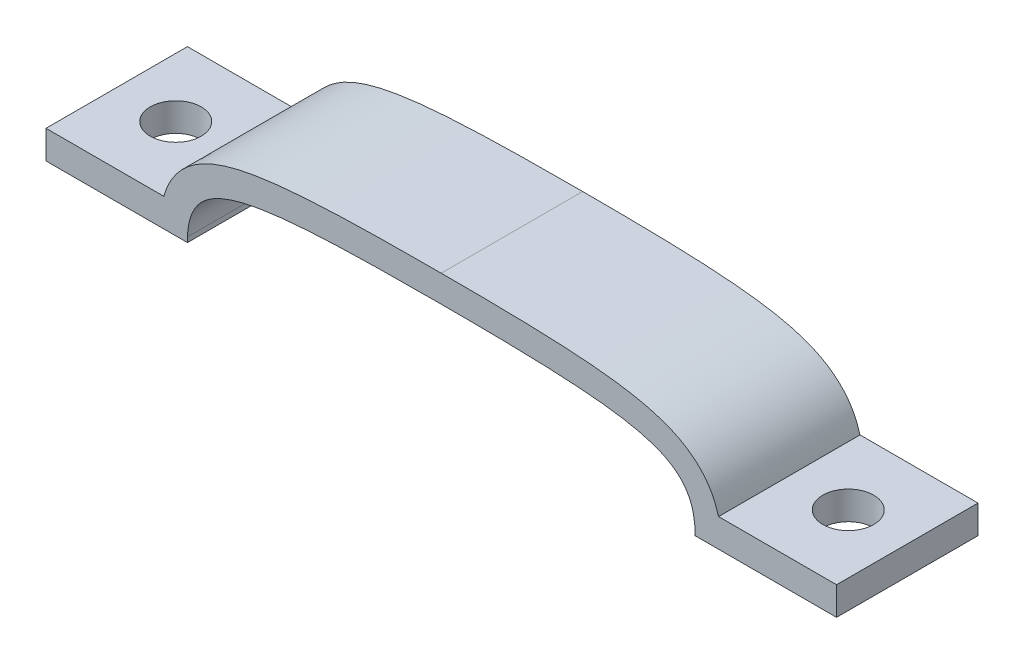
ISO-10303-21;
HEADER;
FILE_DESCRIPTION(('STEP AP214'),'2;1');
FILE_NAME('part.step','',(''),(''),'','','');
FILE_SCHEMA(('AUTOMOTIVE_DESIGN { 1 0 10303 214 1 1 1 1 }'));
ENDSEC;
DATA;
#1=APPLICATION_CONTEXT('core data for automotive mechanical design processes');
#2=APPLICATION_PROTOCOL_DEFINITION('international standard','automotive_design',2000,#1);
#3=PRODUCT_CONTEXT('',#1,'mechanical');
#4=PRODUCT('Part','Part','',(#3));
#5=PRODUCT_RELATED_PRODUCT_CATEGORY('part','',(#4));
#6=PRODUCT_DEFINITION_FORMATION('','',#4);
#7=PRODUCT_DEFINITION_CONTEXT('part definition',#1,'design');
#8=PRODUCT_DEFINITION('design','',#6,#7);
#9=PRODUCT_DEFINITION_SHAPE('','',#8);
#10=(LENGTH_UNIT() NAMED_UNIT(*) SI_UNIT(.MILLI.,.METRE.));
#11=(NAMED_UNIT(*) PLANE_ANGLE_UNIT() SI_UNIT($,.RADIAN.));
#12=(NAMED_UNIT(*) SI_UNIT($,.STERADIAN.) SOLID_ANGLE_UNIT());
#13=UNCERTAINTY_MEASURE_WITH_UNIT(LENGTH_MEASURE(1.E-05),#10,'distance_accuracy_value','');
#14=(GEOMETRIC_REPRESENTATION_CONTEXT(3) GLOBAL_UNCERTAINTY_ASSIGNED_CONTEXT((#13)) GLOBAL_UNIT_ASSIGNED_CONTEXT((#10,
#11,#12)) REPRESENTATION_CONTEXT('',''));
#15=CARTESIAN_POINT('',(0.,0.,0.));
#16=DIRECTION('',(0.,0.,1.));
#17=DIRECTION('',(1.,0.,0.));
#18=AXIS2_PLACEMENT_3D('',#15,#16,#17);
#19=CARTESIAN_POINT('',(-22.279226419423,158.086868585833,10.));
#20=CARTESIAN_POINT('',(-22.2792264195466,158.360588105045,10.));
#21=CARTESIAN_POINT('',(-22.2961874695407,158.836368300295,10.));
#22=CARTESIAN_POINT('',(-22.3755631938051,159.447800617401,10.));
#23=CARTESIAN_POINT('',(-22.4760885577974,159.928281388601,10.));
#24=CARTESIAN_POINT('',(-22.5787710775966,160.307063701637,10.));
#25=CARTESIAN_POINT('',(-22.8045355407532,160.930325250864,10.));
#26=CARTESIAN_POINT('',(-23.2235802799901,161.72514302767,10.));
#27=CARTESIAN_POINT('',(-23.9479829881295,162.553558881146,10.));
#28=CARTESIAN_POINT('',(-25.0052592771367,163.370103577405,10.));
#29=CARTESIAN_POINT('',(-26.3471290029243,163.971682922018,10.));
#30=CARTESIAN_POINT('',(-27.8024570779386,164.375196309339,10.));
#31=CARTESIAN_POINT('',(-29.2062184045047,164.632537515614,10.));
#32=CARTESIAN_POINT('',(-30.5609400295417,164.805515449446,10.));
#33=CARTESIAN_POINT('',(-32.3384486561694,164.966218973878,10.));
#34=CARTESIAN_POINT('',(-34.5145025536922,165.081677344798,10.));
#35=CARTESIAN_POINT('',(-37.085705754605,165.151738274241,10.));
#36=CARTESIAN_POINT('',(-39.6278532585629,165.182162428215,10.));
#37=CARTESIAN_POINT('',(-41.2929588781587,165.186859645389,10.));
#38=CARTESIAN_POINT('',(-42.1292264699186,165.186859626176,10.));
#39=B_SPLINE_CURVE_WITH_KNOTS('',3,(#19,#20,#21,#22,#23,#24,#25,#26,#27,#28,#29,#30,#31,#32,#33,
#34,#35,#36,#37,#38),.UNSPECIFIED.,.F.,.F.,(4,1,1,1,1,1,1,1,1,1,1,1,1,1,1,1,1,4),
(0.755163082288405,0.762814235966892,0.768955564618549,0.77086835303817,0.774693929877414,
0.778116543323867,0.785767697002354,0.793418850680842,0.801070004359329,0.816372311716304,
0.831674619073278,0.846976926430253,0.862279233787228,0.877581541144203,0.908186155858152,
0.938790770572101,0.969395385286051,1.),.UNSPECIFIED.);
#40=DIRECTION('',(0.,0.,-1.));
#41=VECTOR('',#40,1.);
#42=SURFACE_OF_LINEAR_EXTRUSION('',#39,#41);
#43=CARTESIAN_POINT('',(-22.279226419423,158.086868585833,0.));
#44=CARTESIAN_POINT('',(-22.2792264195466,158.360588105045,0.));
#45=CARTESIAN_POINT('',(-22.2961874695407,158.836368300295,0.));
#46=CARTESIAN_POINT('',(-22.3755631938051,159.447800617401,0.));
#47=CARTESIAN_POINT('',(-22.4760885577974,159.928281388601,0.));
#48=CARTESIAN_POINT('',(-22.5787710775966,160.307063701637,0.));
#49=CARTESIAN_POINT('',(-22.8045355407532,160.930325250864,0.));
#50=CARTESIAN_POINT('',(-23.2235802799901,161.72514302767,0.));
#51=CARTESIAN_POINT('',(-23.9479829881295,162.553558881146,0.));
#52=CARTESIAN_POINT('',(-25.0052592771367,163.370103577405,0.));
#53=CARTESIAN_POINT('',(-26.3471290029243,163.971682922018,0.));
#54=CARTESIAN_POINT('',(-27.8024570779386,164.375196309339,0.));
#55=CARTESIAN_POINT('',(-29.2062184045047,164.632537515614,0.));
#56=CARTESIAN_POINT('',(-30.5609400295417,164.805515449446,0.));
#57=CARTESIAN_POINT('',(-32.3384486561694,164.966218973878,0.));
#58=CARTESIAN_POINT('',(-34.5145025536922,165.081677344798,0.));
#59=CARTESIAN_POINT('',(-37.085705754605,165.151738274241,0.));
#60=CARTESIAN_POINT('',(-39.6278532585629,165.182162428215,0.));
#61=CARTESIAN_POINT('',(-41.2929588781587,165.186859645389,0.));
#62=CARTESIAN_POINT('',(-42.1292264699186,165.186859626176,0.));
#63=B_SPLINE_CURVE_WITH_KNOTS('',3,(#43,#44,#45,#46,#47,#48,#49,#50,#51,#52,#53,#54,#55,#56,#57,
#58,#59,#60,#61,#62),.UNSPECIFIED.,.F.,.F.,(4,1,1,1,1,1,1,1,1,1,1,1,1,1,1,1,1,4),
(0.755163082288405,0.762814235966892,0.768955564618549,0.77086835303817,0.774693929877414,
0.778116543323867,0.785767697002354,0.793418850680842,0.801070004359329,0.816372311716304,
0.831674619073278,0.846976926430253,0.862279233787228,0.877581541144203,0.908186155858152,
0.938790770572101,0.969395385286051,1.),.UNSPECIFIED.);
#64=CARTESIAN_POINT('',(-22.5208393164893,160.086868584975,0.));
#65=VERTEX_POINT('',#64);
#66=CARTESIAN_POINT('',(-42.1292264699186,165.186859626176,0.));
#67=VERTEX_POINT('',#66);
#68=EDGE_CURVE('E170',#65,#67,#63,.T.);
#69=ORIENTED_EDGE('',*,*,#68,.T.);
#70=DIRECTION('',(0.,0.,-1.));
#71=VECTOR('',#70,1.);
#72=CARTESIAN_POINT('',(-42.1292264699186,165.186859626176,10.));
#73=LINE('',#72,#71);
#74=CARTESIAN_POINT('',(-42.1292264699186,165.186859626176,10.));
#75=VERTEX_POINT('',#74);
#76=EDGE_CURVE('E11',#75,#67,#73,.T.);
#77=ORIENTED_EDGE('',*,*,#76,.F.);
#78=CARTESIAN_POINT('',(-22.5208393164893,160.086868584975,10.));
#79=VERTEX_POINT('',#78);
#80=EDGE_CURVE('E231',#79,#75,#39,.T.);
#81=ORIENTED_EDGE('',*,*,#80,.F.);
#82=DIRECTION('',(0.,0.,-1.));
#83=VECTOR('',#82,1.);
#84=CARTESIAN_POINT('',(-22.5208393164893,160.086868584975,10.));
#85=LINE('',#84,#83);
#86=EDGE_CURVE('E67',#79,#65,#85,.T.);
#87=ORIENTED_EDGE('',*,*,#86,.T.);
#88=EDGE_LOOP('',(#69,#77,#81,#87));
#89=FACE_BOUND('',#88,.T.);
#90=ADVANCED_FACE('F49',(#89),#42,.F.);
#91=CARTESIAN_POINT('',(-42.1292255274926,165.186859626176,10.));
#92=CARTESIAN_POINT('',(-42.977807036654,165.186859987502,10.));
#93=CARTESIAN_POINT('',(-44.6782244838784,165.181933225482,10.));
#94=CARTESIAN_POINT('',(-47.2092313672923,165.15088207541,10.));
#95=CARTESIAN_POINT('',(-49.7419201198673,165.081555263547,10.));
#96=CARTESIAN_POINT('',(-52.2910384106791,164.945937502511,10.));
#97=CARTESIAN_POINT('',(-54.4550807127518,164.731497457085,10.));
#98=CARTESIAN_POINT('',(-56.2551208170565,164.418028104699,10.));
#99=CARTESIAN_POINT('',(-57.6652128523271,164.049412809791,10.));
#100=CARTESIAN_POINT('',(-59.1826487926131,163.433889640087,10.));
#101=CARTESIAN_POINT('',(-60.5111285985518,162.437445587607,10.));
#102=CARTESIAN_POINT('',(-61.3276484264267,161.228006200388,10.));
#103=CARTESIAN_POINT('',(-61.6384810535281,160.45808418847,10.));
#104=CARTESIAN_POINT('',(-61.8063465981976,159.839823636954,10.));
#105=CARTESIAN_POINT('',(-61.9215491647723,159.221774103895,10.));
#106=CARTESIAN_POINT('',(-61.9572708782868,158.804106440125,10.));
#107=CARTESIAN_POINT('',(-61.9697886624405,158.522875819705,10.));
#108=B_SPLINE_CURVE_WITH_KNOTS('',3,(#91,#92,#93,#94,#95,#96,#97,#98,#99,#100,#101,#102,#103,
#104,#105,#106,#107),.UNSPECIFIED.,.F.,.F.,(4,1,1,1,1,1,1,1,1,1,1,1,1,1,4),(0.500001244760853,
0.53135683189334,0.562712419025827,0.594068006158314,0.625423593290802,0.656779180423289,
0.672456973989533,0.688134767555776,0.70381256112202,0.719490354688263,0.727329251471385,
0.734791010444676,0.738710458836237,0.743007045037629,0.75084594182075),.UNSPECIFIED.);
#109=DIRECTION('',(0.,0.,-1.));
#110=VECTOR('',#109,1.);
#111=SURFACE_OF_LINEAR_EXTRUSION('',#108,#110);
#112=CARTESIAN_POINT('',(-42.1292255274926,165.186859626176,0.));
#113=CARTESIAN_POINT('',(-42.977807036654,165.186859987502,0.));
#114=CARTESIAN_POINT('',(-44.6782244838784,165.181933225482,0.));
#115=CARTESIAN_POINT('',(-47.2092313672923,165.15088207541,0.));
#116=CARTESIAN_POINT('',(-49.7419201198673,165.081555263547,0.));
#117=CARTESIAN_POINT('',(-52.2910384106791,164.945937502511,0.));
#118=CARTESIAN_POINT('',(-54.4550807127518,164.731497457085,0.));
#119=CARTESIAN_POINT('',(-56.2551208170565,164.418028104699,0.));
#120=CARTESIAN_POINT('',(-57.6652128523271,164.049412809791,0.));
#121=CARTESIAN_POINT('',(-59.1826487926131,163.433889640087,0.));
#122=CARTESIAN_POINT('',(-60.5111285985518,162.437445587607,0.));
#123=CARTESIAN_POINT('',(-61.3276484264267,161.228006200388,0.));
#124=CARTESIAN_POINT('',(-61.6384810535281,160.45808418847,0.));
#125=CARTESIAN_POINT('',(-61.8063465981976,159.839823636954,0.));
#126=CARTESIAN_POINT('',(-61.9215491647723,159.221774103895,0.));
#127=CARTESIAN_POINT('',(-61.9572708782868,158.804106440125,0.));
#128=CARTESIAN_POINT('',(-61.9697886624405,158.522875819705,0.));
#129=B_SPLINE_CURVE_WITH_KNOTS('',3,(#112,#113,#114,#115,#116,#117,#118,#119,#120,#121,#122,
#123,#124,#125,#126,#127,#128),.UNSPECIFIED.,.F.,.F.,(4,1,1,1,1,1,1,1,1,1,1,1,1,1,4),
(0.500001244760853,0.53135683189334,0.562712419025827,0.594068006158314,0.625423593290802,
0.656779180423289,0.672456973989533,0.688134767555776,0.70381256112202,0.719490354688263,
0.727329251471385,0.734791010444676,0.738710458836237,0.743007045037629,0.75084594182075),.UNSPECIFIED.);
#130=CARTESIAN_POINT('',(-61.7376114184065,160.086868584885,0.));
#131=VERTEX_POINT('',#130);
#132=EDGE_CURVE('E175',#67,#131,#129,.T.);
#133=ORIENTED_EDGE('',*,*,#132,.T.);
#134=DIRECTION('',(0.,0.,-1.));
#135=VECTOR('',#134,1.);
#136=CARTESIAN_POINT('',(-61.7376114184065,160.086868584885,10.));
#137=LINE('',#136,#135);
#138=CARTESIAN_POINT('',(-61.7376114184065,160.086868584885,10.));
#139=VERTEX_POINT('',#138);
#140=EDGE_CURVE('E59',#139,#131,#137,.T.);
#141=ORIENTED_EDGE('',*,*,#140,.F.);
#142=EDGE_CURVE('E115',#75,#139,#108,.T.);
#143=ORIENTED_EDGE('',*,*,#142,.F.);
#144=ORIENTED_EDGE('',*,*,#76,.T.);
#145=EDGE_LOOP('',(#133,#141,#143,#144));
#146=FACE_BOUND('',#145,.T.);
#147=ADVANCED_FACE('F259',(#146),#111,.F.);
#148=CARTESIAN_POINT('',(-1.59941236239758E-12,160.086868584886,10.));
#149=DIRECTION('',(0.,1.,0.));
#150=DIRECTION('',(-1.,0.,0.));
#151=AXIS2_PLACEMENT_3D('',#148,#149,#150);
#152=PLANE('',#151);
#153=CARTESIAN_POINT('',(-65.9010594599243,160.086868584885,4.9999999999999));
#154=DIRECTION('',(0.,1.,0.));
#155=DIRECTION('',(-1.,0.,0.));
#156=AXIS2_PLACEMENT_3D('',#153,#154,#155);
#157=CIRCLE('',#156,1.79999999999999);
#158=CARTESIAN_POINT('',(-67.7010594599243,160.086868584885,4.9999999999999));
#159=VERTEX_POINT('',#158);
#160=EDGE_CURVE('E176',#159,#159,#157,.T.);
#161=ORIENTED_EDGE('',*,*,#160,.F.);
#162=EDGE_LOOP('',(#161));
#163=FACE_BOUND('',#162,.T.);
#164=DIRECTION('',(1.,0.,0.));
#165=VECTOR('',#164,1.);
#166=CARTESIAN_POINT('',(-1.59941236239758E-12,160.086868584886,0.));
#167=LINE('',#166,#165);
#168=CARTESIAN_POINT('',(-70.071865843106,160.086868584885,0.));
#169=VERTEX_POINT('',#168);
#170=EDGE_CURVE('E185',#169,#131,#167,.T.);
#171=ORIENTED_EDGE('',*,*,#170,.F.);
#172=DIRECTION('',(0.,0.,-1.));
#173=VECTOR('',#172,1.);
#174=CARTESIAN_POINT('',(-70.071865843106,160.086868584885,10.));
#175=LINE('',#174,#173);
#176=CARTESIAN_POINT('',(-70.071865843106,160.086868584885,10.));
#177=VERTEX_POINT('',#176);
#178=EDGE_CURVE('E250',#177,#169,#175,.T.);
#179=ORIENTED_EDGE('',*,*,#178,.F.);
#180=DIRECTION('',(1.,0.,0.));
#181=VECTOR('',#180,1.);
#182=CARTESIAN_POINT('',(-1.59941236239758E-12,160.086868584886,10.));
#183=LINE('',#182,#181);
#184=EDGE_CURVE('E258',#177,#139,#183,.T.);
#185=ORIENTED_EDGE('',*,*,#184,.T.);
#186=ORIENTED_EDGE('',*,*,#140,.T.);
#187=EDGE_LOOP('',(#171,#179,#185,#186));
#188=FACE_BOUND('',#187,.T.);
#189=ADVANCED_FACE('F256',(#163,#188),#152,.T.);
#190=CARTESIAN_POINT('',(-70.071865843106,0.,10.));
#191=DIRECTION('',(-1.,0.,0.));
#192=DIRECTION('',(0.,0.,1.));
#193=AXIS2_PLACEMENT_3D('',#190,#191,#192);
#194=PLANE('',#193);
#195=DIRECTION('',(0.,1.,0.));
#196=VECTOR('',#195,1.);
#197=CARTESIAN_POINT('',(-70.071865843106,0.,0.));
#198=LINE('',#197,#196);
#199=CARTESIAN_POINT('',(-70.071865843106,158.086868584885,0.));
#200=VERTEX_POINT('',#199);
#201=EDGE_CURVE('E192',#200,#169,#198,.T.);
#202=ORIENTED_EDGE('',*,*,#201,.F.);
#203=DIRECTION('',(0.,0.,-1.));
#204=VECTOR('',#203,1.);
#205=CARTESIAN_POINT('',(-70.071865843106,158.086868584885,10.));
#206=LINE('',#205,#204);
#207=CARTESIAN_POINT('',(-70.071865843106,158.086868584885,10.));
#208=VERTEX_POINT('',#207);
#209=EDGE_CURVE('E247',#208,#200,#206,.T.);
#210=ORIENTED_EDGE('',*,*,#209,.F.);
#211=DIRECTION('',(0.,1.,0.));
#212=VECTOR('',#211,1.);
#213=CARTESIAN_POINT('',(-70.071865843106,0.,10.));
#214=LINE('',#213,#212);
#215=EDGE_CURVE('E269',#208,#177,#214,.T.);
#216=ORIENTED_EDGE('',*,*,#215,.T.);
#217=ORIENTED_EDGE('',*,*,#178,.T.);
#218=EDGE_LOOP('',(#202,#210,#216,#217));
#219=FACE_BOUND('',#218,.T.);
#220=ADVANCED_FACE('F266',(#219),#194,.T.);
#221=CARTESIAN_POINT('',(-4.38779203484577E-13,158.086868584885,10.));
#222=DIRECTION('',(0.,-1.,0.));
#223=DIRECTION('',(1.,0.,0.));
#224=AXIS2_PLACEMENT_3D('',#221,#222,#223);
#225=PLANE('',#224);
#226=CARTESIAN_POINT('',(-65.9010594599243,158.086868584975,4.9999999999999));
#227=DIRECTION('',(0.,-1.,0.));
#228=DIRECTION('',(0.,0.,-1.));
#229=AXIS2_PLACEMENT_3D('',#226,#227,#228);
#230=CIRCLE('',#229,1.79999999999998);
#231=CARTESIAN_POINT('',(-65.9010594599243,158.086868584975,3.19999999999992));
#232=VERTEX_POINT('',#231);
#233=EDGE_CURVE('E355',#232,#232,#230,.T.);
#234=ORIENTED_EDGE('',*,*,#233,.F.);
#235=EDGE_LOOP('',(#234));
#236=FACE_BOUND('',#235,.T.);
#237=DIRECTION('',(-1.,0.,0.));
#238=VECTOR('',#237,1.);
#239=CARTESIAN_POINT('',(-4.38779203484577E-13,158.086868584885,0.));
#240=LINE('',#239,#238);
#241=CARTESIAN_POINT('',(-60.071865843106,158.086868584885,0.));
#242=VERTEX_POINT('',#241);
#243=EDGE_CURVE('E196',#242,#200,#240,.T.);
#244=ORIENTED_EDGE('',*,*,#243,.F.);
#245=DIRECTION('',(0.,0.,-1.));
#246=VECTOR('',#245,1.);
#247=CARTESIAN_POINT('',(-60.071865843106,158.086868584885,10.));
#248=LINE('',#247,#246);
#249=CARTESIAN_POINT('',(-60.071865843106,158.086868584885,10.));
#250=VERTEX_POINT('',#249);
#251=EDGE_CURVE('E244',#250,#242,#248,.T.);
#252=ORIENTED_EDGE('',*,*,#251,.F.);
#253=DIRECTION('',(-1.,0.,0.));
#254=VECTOR('',#253,1.);
#255=CARTESIAN_POINT('',(-4.38779203484577E-13,158.086868584885,10.));
#256=LINE('',#255,#254);
#257=EDGE_CURVE('E276',#250,#208,#256,.T.);
#258=ORIENTED_EDGE('',*,*,#257,.T.);
#259=ORIENTED_EDGE('',*,*,#209,.T.);
#260=EDGE_LOOP('',(#244,#252,#258,#259));
#261=FACE_BOUND('',#260,.T.);
#262=ADVANCED_FACE('F312',(#236,#261),#225,.T.);
#263=CARTESIAN_POINT('',(-60.071865843106,0.,10.));
#264=DIRECTION('',(1.,0.,0.));
#265=DIRECTION('',(0.,0.,-1.));
#266=AXIS2_PLACEMENT_3D('',#263,#264,#265);
#267=PLANE('',#266);
#268=DIRECTION('',(0.,-1.,0.));
#269=VECTOR('',#268,1.);
#270=CARTESIAN_POINT('',(-60.071865843106,0.,0.));
#271=LINE('',#270,#269);
#272=CARTESIAN_POINT('',(-60.071865843106,158.433944586096,0.));
#273=VERTEX_POINT('',#272);
#274=EDGE_CURVE('E200',#273,#242,#271,.T.);
#275=ORIENTED_EDGE('',*,*,#274,.F.);
#276=DIRECTION('',(0.,0.,-1.));
#277=VECTOR('',#276,1.);
#278=CARTESIAN_POINT('',(-60.071865843106,158.433944586096,10.));
#279=LINE('',#278,#277);
#280=CARTESIAN_POINT('',(-60.071865843106,158.433944586096,10.));
#281=VERTEX_POINT('',#280);
#282=EDGE_CURVE('E241',#281,#273,#279,.T.);
#283=ORIENTED_EDGE('',*,*,#282,.F.);
#284=DIRECTION('',(0.,-1.,0.));
#285=VECTOR('',#284,1.);
#286=CARTESIAN_POINT('',(-60.071865843106,0.,10.));
#287=LINE('',#286,#285);
#288=EDGE_CURVE('E285',#281,#250,#287,.T.);
#289=ORIENTED_EDGE('',*,*,#288,.T.);
#290=ORIENTED_EDGE('',*,*,#251,.T.);
#291=EDGE_LOOP('',(#275,#283,#289,#290));
#292=FACE_BOUND('',#291,.T.);
#293=ADVANCED_FACE('F307',(#292),#267,.T.);
#294=CARTESIAN_POINT('',(-42.1292263365123,163.286859626176,10.));
#295=CARTESIAN_POINT('',(-43.8105168114971,163.286860342069,10.));
#296=CARTESIAN_POINT('',(-46.3466695356581,163.273840814988,10.));
#297=CARTESIAN_POINT('',(-49.6708137277256,163.182542922421,10.));
#298=CARTESIAN_POINT('',(-52.1576858020797,163.050705665859,10.));
#299=CARTESIAN_POINT('',(-54.6335401610709,162.800940146441,10.));
#300=CARTESIAN_POINT('',(-56.6878236727636,162.397641303319,10.));
#301=CARTESIAN_POINT('',(-58.265533161416,161.746859791373,10.));
#302=CARTESIAN_POINT('',(-59.3215898066884,160.93186501266,10.));
#303=CARTESIAN_POINT('',(-59.9470059571866,159.721222926098,10.));
#304=CARTESIAN_POINT('',(-60.0527348646729,158.863750442144,10.));
#305=CARTESIAN_POINT('',(-60.071865843106,158.433944586096,10.));
#306=B_SPLINE_CURVE_WITH_KNOTS('',3,(#294,#295,#296,#297,#298,#299,#300,#301,#302,#303,#304,
#305),.UNSPECIFIED.,.F.,.F.,(4,1,1,1,1,1,1,1,1,4),(0.500001244760853,0.562726434486051,
0.59408902934865,0.625451624211249,0.656814219073848,0.688176813936447,0.703858111367746,
0.719539408799046,0.735220706230345,0.750902003661645),.UNSPECIFIED.);
#307=DIRECTION('',(0.,0.,-1.));
#308=VECTOR('',#307,1.);
#309=SURFACE_OF_LINEAR_EXTRUSION('',#306,#308);
#310=CARTESIAN_POINT('',(-42.1292263365123,163.286859626176,0.));
#311=CARTESIAN_POINT('',(-43.8105168114971,163.286860342069,0.));
#312=CARTESIAN_POINT('',(-46.3466695356581,163.273840814988,0.));
#313=CARTESIAN_POINT('',(-49.6708137277256,163.182542922421,0.));
#314=CARTESIAN_POINT('',(-52.1576858020797,163.050705665859,0.));
#315=CARTESIAN_POINT('',(-54.6335401610709,162.800940146441,0.));
#316=CARTESIAN_POINT('',(-56.6878236727636,162.397641303319,0.));
#317=CARTESIAN_POINT('',(-58.265533161416,161.746859791373,0.));
#318=CARTESIAN_POINT('',(-59.3215898066884,160.93186501266,0.));
#319=CARTESIAN_POINT('',(-59.9470059571866,159.721222926098,0.));
#320=CARTESIAN_POINT('',(-60.0527348646729,158.863750442144,0.));
#321=CARTESIAN_POINT('',(-60.071865843106,158.433944586096,0.));
#322=B_SPLINE_CURVE_WITH_KNOTS('',3,(#310,#311,#312,#313,#314,#315,#316,#317,#318,#319,#320,
#321),.UNSPECIFIED.,.F.,.F.,(4,1,1,1,1,1,1,1,1,4),(0.500001244760853,0.562726434486051,
0.59408902934865,0.625451624211249,0.656814219073848,0.688176813936447,0.703858111367746,
0.719539408799046,0.735220706230345,0.750902003661645),.UNSPECIFIED.);
#323=CARTESIAN_POINT('',(-42.1292264262671,163.286859626176,0.));
#324=VERTEX_POINT('',#323);
#325=EDGE_CURVE('E204',#324,#273,#322,.T.);
#326=ORIENTED_EDGE('',*,*,#325,.F.);
#327=DIRECTION('',(0.,0.,-1.));
#328=VECTOR('',#327,1.);
#329=CARTESIAN_POINT('',(-42.1292264262671,163.286859626176,10.));
#330=LINE('',#329,#328);
#331=CARTESIAN_POINT('',(-42.1292264262671,163.286859626176,10.));
#332=VERTEX_POINT('',#331);
#333=EDGE_CURVE('E238',#332,#324,#330,.T.);
#334=ORIENTED_EDGE('',*,*,#333,.F.);
#335=EDGE_CURVE('E289',#332,#281,#306,.T.);
#336=ORIENTED_EDGE('',*,*,#335,.T.);
#337=ORIENTED_EDGE('',*,*,#282,.T.);
#338=EDGE_LOOP('',(#326,#334,#336,#337));
#339=FACE_BOUND('',#338,.T.);
#340=ADVANCED_FACE('F302',(#339),#309,.T.);
#341=CARTESIAN_POINT('',(-24.179226419423,158.086868584975,10.));
#342=CARTESIAN_POINT('',(-24.1792264196202,158.523417859722,10.));
#343=CARTESIAN_POINT('',(-24.2356844006855,159.392010479686,10.));
#344=CARTESIAN_POINT('',(-24.7381637568733,160.685431171222,10.));
#345=CARTESIAN_POINT('',(-25.7619077827199,161.618567295625,10.));
#346=CARTESIAN_POINT('',(-26.9687924651181,162.167965524831,10.));
#347=CARTESIAN_POINT('',(-28.2198631936222,162.519776540143,10.));
#348=CARTESIAN_POINT('',(-29.9132921775133,162.830153248551,10.));
#349=CARTESIAN_POINT('',(-32.0394547068804,163.04667452592,10.));
#350=CARTESIAN_POINT('',(-34.5866795768751,163.183060855706,10.));
#351=CARTESIAN_POINT('',(-37.1205926216893,163.25193388784,10.));
#352=CARTESIAN_POINT('',(-39.6400896937565,163.282196609287,10.));
#353=CARTESIAN_POINT('',(-41.2976688447584,163.286859645281,10.));
#354=CARTESIAN_POINT('',(-42.1292264262671,163.286859626176,10.));
#355=B_SPLINE_CURVE_WITH_KNOTS('',3,(#341,#342,#343,#344,#345,#346,#347,#348,#349,#350,#351,
#352,#353,#354),.UNSPECIFIED.,.F.,.F.,(4,1,1,1,1,1,1,1,1,1,1,4),(0.755163082288405,
0.77046538964538,0.785767697002354,0.801070004359329,0.816372311716304,0.831674619073278,
0.846976926430253,0.877581541144203,0.908186155858152,0.938790770572101,0.969395385286051,1.),.UNSPECIFIED.);
#356=DIRECTION('',(0.,0.,-1.));
#357=VECTOR('',#356,1.);
#358=SURFACE_OF_LINEAR_EXTRUSION('',#355,#357);
#359=CARTESIAN_POINT('',(-24.179226419423,158.086868584975,0.));
#360=CARTESIAN_POINT('',(-24.1792264196202,158.523417859722,0.));
#361=CARTESIAN_POINT('',(-24.2356844006855,159.392010479686,0.));
#362=CARTESIAN_POINT('',(-24.7381637568733,160.685431171222,0.));
#363=CARTESIAN_POINT('',(-25.7619077827199,161.618567295625,0.));
#364=CARTESIAN_POINT('',(-26.9687924651181,162.167965524831,0.));
#365=CARTESIAN_POINT('',(-28.2198631936222,162.519776540143,0.));
#366=CARTESIAN_POINT('',(-29.9132921775133,162.830153248551,0.));
#367=CARTESIAN_POINT('',(-32.0394547068804,163.04667452592,0.));
#368=CARTESIAN_POINT('',(-34.5866795768751,163.183060855706,0.));
#369=CARTESIAN_POINT('',(-37.1205926216893,163.25193388784,0.));
#370=CARTESIAN_POINT('',(-39.6400896937565,163.282196609287,0.));
#371=CARTESIAN_POINT('',(-41.2976688447584,163.286859645281,0.));
#372=CARTESIAN_POINT('',(-42.1292264262671,163.286859626176,0.));
#373=B_SPLINE_CURVE_WITH_KNOTS('',3,(#359,#360,#361,#362,#363,#364,#365,#366,#367,#368,#369,
#370,#371,#372),.UNSPECIFIED.,.F.,.F.,(4,1,1,1,1,1,1,1,1,1,1,4),(0.755163082288405,
0.77046538964538,0.785767697002354,0.801070004359329,0.816372311716304,0.831674619073278,
0.846976926430253,0.877581541144203,0.908186155858152,0.938790770572101,0.969395385286051,1.),.UNSPECIFIED.);
#374=CARTESIAN_POINT('',(-24.179226419423,158.086868584975,0.));
#375=VERTEX_POINT('',#374);
#376=EDGE_CURVE('E210',#375,#324,#373,.T.);
#377=ORIENTED_EDGE('',*,*,#376,.F.);
#378=DIRECTION('',(0.,0.,-1.));
#379=VECTOR('',#378,1.);
#380=CARTESIAN_POINT('',(-24.179226419423,158.086868584975,10.));
#381=LINE('',#380,#379);
#382=CARTESIAN_POINT('',(-24.179226419423,158.086868584975,10.));
#383=VERTEX_POINT('',#382);
#384=EDGE_CURVE('E160',#383,#375,#381,.T.);
#385=ORIENTED_EDGE('',*,*,#384,.F.);
#386=EDGE_CURVE('E148',#383,#332,#355,.T.);
#387=ORIENTED_EDGE('',*,*,#386,.T.);
#388=ORIENTED_EDGE('',*,*,#333,.T.);
#389=EDGE_LOOP('',(#377,#385,#387,#388));
#390=FACE_BOUND('',#389,.T.);
#391=ADVANCED_FACE('F306',(#390),#358,.T.);
#392=CARTESIAN_POINT('',(0.,158.086868584975,10.));
#393=DIRECTION('',(0.,1.,0.));
#394=DIRECTION('',(0.,0.,1.));
#395=AXIS2_PLACEMENT_3D('',#392,#393,#394);
#396=PLANE('',#395);
#397=CARTESIAN_POINT('',(-18.3500329333073,158.086868584975,4.99999999999991));
#398=DIRECTION('',(0.,-1.,0.));
#399=DIRECTION('',(0.,0.,-1.));
#400=AXIS2_PLACEMENT_3D('',#397,#398,#399);
#401=CIRCLE('',#400,1.79999999999999);
#402=CARTESIAN_POINT('',(-18.3500329333073,158.086868584975,3.19999999999992));
#403=VERTEX_POINT('',#402);
#404=EDGE_CURVE('E348',#403,#403,#401,.T.);
#405=ORIENTED_EDGE('',*,*,#404,.F.);
#406=EDGE_LOOP('',(#405));
#407=FACE_BOUND('',#406,.T.);
#408=DIRECTION('',(1.,0.,0.));
#409=VECTOR('',#408,1.);
#410=CARTESIAN_POINT('',(0.,158.086868584975,0.));
#411=LINE('',#410,#409);
#412=CARTESIAN_POINT('',(-14.179226419423,158.086868584975,0.));
#413=VERTEX_POINT('',#412);
#414=EDGE_CURVE('E156',#375,#413,#411,.T.);
#415=ORIENTED_EDGE('',*,*,#414,.T.);
#416=DIRECTION('',(0.,0.,-1.));
#417=VECTOR('',#416,1.);
#418=CARTESIAN_POINT('',(-14.179226419423,158.086868584975,10.));
#419=LINE('',#418,#417);
#420=CARTESIAN_POINT('',(-14.179226419423,158.086868584975,10.));
#421=VERTEX_POINT('',#420);
#422=EDGE_CURVE('E153',#421,#413,#419,.T.);
#423=ORIENTED_EDGE('',*,*,#422,.F.);
#424=DIRECTION('',(1.,0.,0.));
#425=VECTOR('',#424,1.);
#426=CARTESIAN_POINT('',(0.,158.086868584975,10.));
#427=LINE('',#426,#425);
#428=EDGE_CURVE('E140',#383,#421,#427,.T.);
#429=ORIENTED_EDGE('',*,*,#428,.F.);
#430=ORIENTED_EDGE('',*,*,#384,.T.);
#431=EDGE_LOOP('',(#415,#423,#429,#430));
#432=FACE_BOUND('',#431,.T.);
#433=ADVANCED_FACE('F154',(#407,#432),#396,.F.);
#434=CARTESIAN_POINT('',(-14.179226419423,0.,10.));
#435=DIRECTION('',(-1.,0.,0.));
#436=DIRECTION('',(0.,0.,1.));
#437=AXIS2_PLACEMENT_3D('',#434,#435,#436);
#438=PLANE('',#437);
#439=DIRECTION('',(0.,1.,0.));
#440=VECTOR('',#439,1.);
#441=CARTESIAN_POINT('',(-14.179226419423,0.,0.));
#442=LINE('',#441,#440);
#443=CARTESIAN_POINT('',(-14.179226419423,160.086868584975,0.));
#444=VERTEX_POINT('',#443);
#445=EDGE_CURVE('E224',#413,#444,#442,.T.);
#446=ORIENTED_EDGE('',*,*,#445,.T.);
#447=DIRECTION('',(0.,0.,-1.));
#448=VECTOR('',#447,1.);
#449=CARTESIAN_POINT('',(-14.179226419423,160.086868584975,10.));
#450=LINE('',#449,#448);
#451=CARTESIAN_POINT('',(-14.179226419423,160.086868584975,10.));
#452=VERTEX_POINT('',#451);
#453=EDGE_CURVE('E103',#452,#444,#450,.T.);
#454=ORIENTED_EDGE('',*,*,#453,.F.);
#455=DIRECTION('',(0.,1.,0.));
#456=VECTOR('',#455,1.);
#457=CARTESIAN_POINT('',(-14.179226419423,0.,10.));
#458=LINE('',#457,#456);
#459=EDGE_CURVE('E145',#421,#452,#458,.T.);
#460=ORIENTED_EDGE('',*,*,#459,.F.);
#461=ORIENTED_EDGE('',*,*,#422,.T.);
#462=EDGE_LOOP('',(#446,#454,#460,#461));
#463=FACE_BOUND('',#462,.T.);
#464=ADVANCED_FACE('F162',(#463),#438,.F.);
#465=CARTESIAN_POINT('',(0.,160.086868584975,10.));
#466=DIRECTION('',(0.,1.,0.));
#467=DIRECTION('',(0.,0.,1.));
#468=AXIS2_PLACEMENT_3D('',#465,#466,#467);
#469=PLANE('',#468);
#470=CARTESIAN_POINT('',(-18.3500329333073,160.086868584975,4.99999999999991));
#471=DIRECTION('',(0.,1.,0.));
#472=DIRECTION('',(0.,0.,1.));
#473=AXIS2_PLACEMENT_3D('',#470,#471,#472);
#474=CIRCLE('',#473,1.79999999999999);
#475=CARTESIAN_POINT('',(-18.3500329333073,160.086868584975,6.7999999999999));
#476=VERTEX_POINT('',#475);
#477=EDGE_CURVE('E351',#476,#476,#474,.T.);
#478=ORIENTED_EDGE('',*,*,#477,.F.);
#479=EDGE_LOOP('',(#478));
#480=FACE_BOUND('',#479,.T.);
#481=DIRECTION('',(1.,0.,0.));
#482=VECTOR('',#481,1.);
#483=CARTESIAN_POINT('',(0.,160.086868584975,0.));
#484=LINE('',#483,#482);
#485=EDGE_CURVE('E227',#65,#444,#484,.T.);
#486=ORIENTED_EDGE('',*,*,#485,.F.);
#487=ORIENTED_EDGE('',*,*,#86,.F.);
#488=DIRECTION('',(1.,0.,0.));
#489=VECTOR('',#488,1.);
#490=CARTESIAN_POINT('',(0.,160.086868584975,10.));
#491=LINE('',#490,#489);
#492=EDGE_CURVE('E164',#79,#452,#491,.T.);
#493=ORIENTED_EDGE('',*,*,#492,.T.);
#494=ORIENTED_EDGE('',*,*,#453,.T.);
#495=EDGE_LOOP('',(#486,#487,#493,#494));
#496=FACE_BOUND('',#495,.T.);
#497=ADVANCED_FACE('F327',(#480,#496),#469,.T.);
#498=CARTESIAN_POINT('',(0.,0.,10.));
#499=DIRECTION('',(0.,0.,1.));
#500=DIRECTION('',(1.,0.,0.));
#501=AXIS2_PLACEMENT_3D('',#498,#499,#500);
#502=PLANE('',#501);
#503=ORIENTED_EDGE('',*,*,#80,.T.);
#504=ORIENTED_EDGE('',*,*,#142,.T.);
#505=ORIENTED_EDGE('',*,*,#184,.F.);
#506=ORIENTED_EDGE('',*,*,#215,.F.);
#507=ORIENTED_EDGE('',*,*,#257,.F.);
#508=ORIENTED_EDGE('',*,*,#288,.F.);
#509=ORIENTED_EDGE('',*,*,#335,.F.);
#510=ORIENTED_EDGE('',*,*,#386,.F.);
#511=ORIENTED_EDGE('',*,*,#428,.T.);
#512=ORIENTED_EDGE('',*,*,#459,.T.);
#513=ORIENTED_EDGE('',*,*,#492,.F.);
#514=EDGE_LOOP('',(#503,#504,#505,#506,#507,#508,#509,#510,#511,#512,#513));
#515=FACE_BOUND('',#514,.T.);
#516=ADVANCED_FACE('F142',(#515),#502,.T.);
#517=CARTESIAN_POINT('',(0.,0.,0.));
#518=DIRECTION('',(0.,0.,1.));
#519=DIRECTION('',(1.,0.,0.));
#520=AXIS2_PLACEMENT_3D('',#517,#518,#519);
#521=PLANE('',#520);
#522=ORIENTED_EDGE('',*,*,#68,.F.);
#523=ORIENTED_EDGE('',*,*,#485,.T.);
#524=ORIENTED_EDGE('',*,*,#445,.F.);
#525=ORIENTED_EDGE('',*,*,#414,.F.);
#526=ORIENTED_EDGE('',*,*,#376,.T.);
#527=ORIENTED_EDGE('',*,*,#325,.T.);
#528=ORIENTED_EDGE('',*,*,#274,.T.);
#529=ORIENTED_EDGE('',*,*,#243,.T.);
#530=ORIENTED_EDGE('',*,*,#201,.T.);
#531=ORIENTED_EDGE('',*,*,#170,.T.);
#532=ORIENTED_EDGE('',*,*,#132,.F.);
#533=EDGE_LOOP('',(#522,#523,#524,#525,#526,#527,#528,#529,#530,#531,#532));
#534=FACE_BOUND('',#533,.T.);
#535=ADVANCED_FACE('F262',(#534),#521,.F.);
#536=CARTESIAN_POINT('',(-65.9010594599243,158.086868584975,4.9999999999999));
#537=DIRECTION('',(0.,-1.,0.));
#538=DIRECTION('',(0.,0.,-1.));
#539=AXIS2_PLACEMENT_3D('',#536,#537,#538);
#540=CYLINDRICAL_SURFACE('',#539,1.79999999999999);
#541=ORIENTED_EDGE('',*,*,#160,.T.);
#542=EDGE_LOOP('',(#541));
#543=FACE_BOUND('',#542,.T.);
#544=ORIENTED_EDGE('',*,*,#233,.T.);
#545=EDGE_LOOP('',(#544));
#546=FACE_BOUND('',#545,.T.);
#547=ADVANCED_FACE('F372',(#543,#546),#540,.F.);
#548=CARTESIAN_POINT('',(-18.3500329333073,158.086868584975,4.99999999999991));
#549=DIRECTION('',(0.,-1.,0.));
#550=DIRECTION('',(0.,0.,-1.));
#551=AXIS2_PLACEMENT_3D('',#548,#549,#550);
#552=CYLINDRICAL_SURFACE('',#551,1.79999999999999);
#553=ORIENTED_EDGE('',*,*,#477,.T.);
#554=EDGE_LOOP('',(#553));
#555=FACE_BOUND('',#554,.T.);
#556=ORIENTED_EDGE('',*,*,#404,.T.);
#557=EDGE_LOOP('',(#556));
#558=FACE_BOUND('',#557,.T.);
#559=ADVANCED_FACE('F374',(#555,#558),#552,.F.);
#560=CLOSED_SHELL('',(#90,#147,#189,#220,#262,#293,#340,#391,#433,#464,#497,#516,#535,#547,#559));
#561=MANIFOLD_SOLID_BREP('B2',#560);
#562=ADVANCED_BREP_SHAPE_REPRESENTATION('',(#18,#561),#14);
#563=SHAPE_DEFINITION_REPRESENTATION(#9,#562);
ENDSEC;
END-ISO-10303-21;
